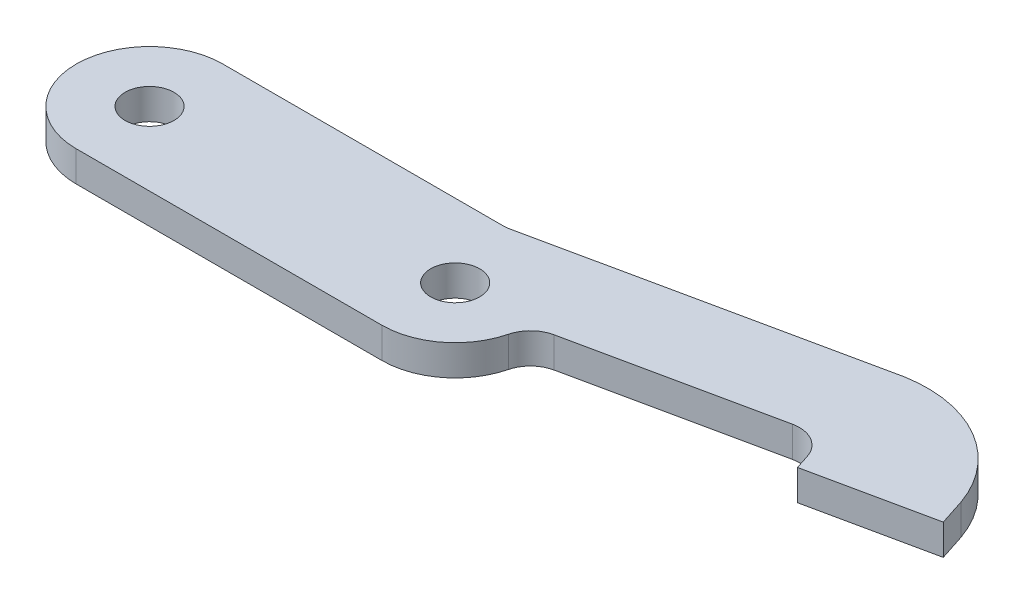
ISO-10303-21;
HEADER;
FILE_DESCRIPTION(('STEP AP214'),'2;1');
FILE_NAME('part.step','',(''),(''),'','','');
FILE_SCHEMA(('AUTOMOTIVE_DESIGN { 1 0 10303 214 1 1 1 1 }'));
ENDSEC;
DATA;
#1=APPLICATION_CONTEXT('core data for automotive mechanical design processes');
#2=APPLICATION_PROTOCOL_DEFINITION('international standard','automotive_design',2000,#1);
#3=PRODUCT_CONTEXT('',#1,'mechanical');
#4=PRODUCT('Part','Part','',(#3));
#5=PRODUCT_RELATED_PRODUCT_CATEGORY('part','',(#4));
#6=PRODUCT_DEFINITION_FORMATION('','',#4);
#7=PRODUCT_DEFINITION_CONTEXT('part definition',#1,'design');
#8=PRODUCT_DEFINITION('design','',#6,#7);
#9=PRODUCT_DEFINITION_SHAPE('','',#8);
#10=(LENGTH_UNIT() NAMED_UNIT(*) SI_UNIT(.MILLI.,.METRE.));
#11=(NAMED_UNIT(*) PLANE_ANGLE_UNIT() SI_UNIT($,.RADIAN.));
#12=(NAMED_UNIT(*) SI_UNIT($,.STERADIAN.) SOLID_ANGLE_UNIT());
#13=UNCERTAINTY_MEASURE_WITH_UNIT(LENGTH_MEASURE(1.E-05),#10,'distance_accuracy_value','');
#14=(GEOMETRIC_REPRESENTATION_CONTEXT(3) GLOBAL_UNCERTAINTY_ASSIGNED_CONTEXT((#13)) GLOBAL_UNIT_ASSIGNED_CONTEXT((#10,
#11,#12)) REPRESENTATION_CONTEXT('',''));
#15=CARTESIAN_POINT('',(0.,0.,0.));
#16=DIRECTION('',(0.,0.,1.));
#17=DIRECTION('',(1.,0.,0.));
#18=AXIS2_PLACEMENT_3D('',#15,#16,#17);
#19=CARTESIAN_POINT('',(103.549877420006,5.,-3.73359056805985));
#20=DIRECTION('',(0.,1.,0.));
#21=DIRECTION('',(0.,0.,1.));
#22=AXIS2_PLACEMENT_3D('',#19,#20,#21);
#23=PLANE('',#22);
#24=CARTESIAN_POINT('',(0.,5.,0.));
#25=DIRECTION('',(0.,1.,0.));
#26=DIRECTION('',(0.,0.,1.));
#27=AXIS2_PLACEMENT_3D('',#24,#25,#26);
#28=CIRCLE('',#27,4.);
#29=CARTESIAN_POINT('',(0.,5.,4.));
#30=VERTEX_POINT('',#29);
#31=EDGE_CURVE('E242',#30,#30,#28,.T.);
#32=ORIENTED_EDGE('',*,*,#31,.F.);
#33=EDGE_LOOP('',(#32));
#34=FACE_BOUND('',#33,.T.);
#35=CARTESIAN_POINT('',(103.549877420006,5.,-3.73359056805985));
#36=DIRECTION('',(0.,1.,0.));
#37=DIRECTION('',(0.,0.,1.));
#38=AXIS2_PLACEMENT_3D('',#35,#36,#37);
#39=CIRCLE('',#38,20.);
#40=CARTESIAN_POINT('',(122.439553034053,5.,-10.3047514393287));
#41=VERTEX_POINT('',#40);
#42=CARTESIAN_POINT('',(100.107664182939,5.,-23.4351429949768));
#43=VERTEX_POINT('',#42);
#44=EDGE_CURVE('E132',#41,#43,#39,.T.);
#45=ORIENTED_EDGE('',*,*,#44,.T.);
#46=DIRECTION('',(-0.978147600733806,0.,0.20791169081776));
#47=VECTOR('',#46,1.);
#48=CARTESIAN_POINT('',(46.3095461425795,5.,-12.));
#49=LINE('',#48,#47);
#50=CARTESIAN_POINT('',(46.8235834203399,5.,-12.109261996331));
#51=VERTEX_POINT('',#50);
#52=EDGE_CURVE('E123',#43,#51,#49,.T.);
#53=ORIENTED_EDGE('',*,*,#52,.T.);
#54=CARTESIAN_POINT('',(45.7840249662511,5.,-17.));
#55=DIRECTION('',(0.,1.,0.));
#56=DIRECTION('',(0.,0.,1.));
#57=AXIS2_PLACEMENT_3D('',#54,#55,#56);
#58=CIRCLE('',#57,5.);
#59=CARTESIAN_POINT('',(45.7840249662511,5.,-12.));
#60=VERTEX_POINT('',#59);
#61=EDGE_CURVE('E11',#51,#60,#58,.F.);
#62=ORIENTED_EDGE('',*,*,#61,.T.);
#63=DIRECTION('',(-1.,0.,0.));
#64=VECTOR('',#63,1.);
#65=CARTESIAN_POINT('',(0.,5.,-12.));
#66=LINE('',#65,#64);
#67=CARTESIAN_POINT('',(0.,5.,-12.));
#68=VERTEX_POINT('',#67);
#69=EDGE_CURVE('E131',#60,#68,#66,.T.);
#70=ORIENTED_EDGE('',*,*,#69,.T.);
#71=CARTESIAN_POINT('',(0.,5.,0.));
#72=DIRECTION('',(0.,1.,0.));
#73=DIRECTION('',(0.,0.,1.));
#74=AXIS2_PLACEMENT_3D('',#71,#72,#73);
#75=CIRCLE('',#74,12.);
#76=CARTESIAN_POINT('',(0.,5.,12.));
#77=VERTEX_POINT('',#76);
#78=EDGE_CURVE('E250',#68,#77,#75,.T.);
#79=ORIENTED_EDGE('',*,*,#78,.T.);
#80=DIRECTION('',(1.,0.,0.));
#81=VECTOR('',#80,1.);
#82=CARTESIAN_POINT('',(0.,5.,12.));
#83=LINE('',#82,#81);
#84=CARTESIAN_POINT('',(50.,5.,12.));
#85=VERTEX_POINT('',#84);
#86=EDGE_CURVE('E229',#77,#85,#83,.T.);
#87=ORIENTED_EDGE('',*,*,#86,.T.);
#88=CARTESIAN_POINT('',(50.,5.,0.));
#89=DIRECTION('',(0.,1.,0.));
#90=DIRECTION('',(0.,0.,1.));
#91=AXIS2_PLACEMENT_3D('',#88,#89,#90);
#92=CIRCLE('',#91,12.);
#93=CARTESIAN_POINT('',(61.6353980817676,5.,2.93555982374721));
#94=VERTEX_POINT('',#93);
#95=EDGE_CURVE('E246',#85,#94,#92,.T.);
#96=ORIENTED_EDGE('',*,*,#95,.T.);
#97=CARTESIAN_POINT('',(66.4834806158375,5.,4.15870975030855));
#98=DIRECTION('',(0.,1.,0.));
#99=DIRECTION('',(0.,0.,1.));
#100=AXIS2_PLACEMENT_3D('',#97,#98,#99);
#101=CIRCLE('',#100,5.);
#102=CARTESIAN_POINT('',(65.4439221617486,5.,-0.732028253360483));
#103=VERTEX_POINT('',#102);
#104=EDGE_CURVE('E169',#94,#103,#101,.F.);
#105=ORIENTED_EDGE('',*,*,#104,.T.);
#106=DIRECTION('',(0.978147600733805,0.,-0.20791169081776));
#107=VECTOR('',#106,1.);
#108=CARTESIAN_POINT('',(62.,5.,0.));
#109=LINE('',#108,#107);
#110=CARTESIAN_POINT('',(97.5926662979977,5.,-7.56545476897087));
#111=VERTEX_POINT('',#110);
#112=EDGE_CURVE('E180',#103,#111,#109,.T.);
#113=ORIENTED_EDGE('',*,*,#112,.T.);
#114=CARTESIAN_POINT('',(98.6322247520865,5.,-2.67471676530185));
#115=DIRECTION('',(0.,1.,0.));
#116=DIRECTION('',(0.,0.,1.));
#117=AXIS2_PLACEMENT_3D('',#114,#115,#116);
#118=CIRCLE('',#117,5.);
#119=CARTESIAN_POINT('',(103.388793992081,5.,-4.2158361847941));
#120=VERTEX_POINT('',#119);
#121=EDGE_CURVE('E173',#111,#120,#118,.F.);
#122=ORIENTED_EDGE('',*,*,#121,.T.);
#123=DIRECTION('',(0.308223883898451,0.,0.951313847998942));
#124=VECTOR('',#123,1.);
#125=CARTESIAN_POINT('',(104.157567187289,5.,-1.84306553080831));
#126=LINE('',#125,#124);
#127=CARTESIAN_POINT('',(104.157567187289,5.,-1.84306553080831));
#128=VERTEX_POINT('',#127);
#129=EDGE_CURVE('E177',#120,#128,#126,.T.);
#130=ORIENTED_EDGE('',*,*,#129,.T.);
#131=DIRECTION('',(0.978147600733807,0.,-0.207911690817753));
#132=VECTOR('',#131,1.);
#133=CARTESIAN_POINT('',(104.157567187289,5.,-1.84306553080831));
#134=LINE('',#133,#132);
#135=CARTESIAN_POINT('',(123.826560511596,5.,-6.02383912333345));
#136=VERTEX_POINT('',#135);
#137=EDGE_CURVE('E190',#128,#136,#134,.T.);
#138=ORIENTED_EDGE('',*,*,#137,.T.);
#139=DIRECTION('',(-0.308223883898451,0.,-0.951313847998942));
#140=VECTOR('',#139,1.);
#141=CARTESIAN_POINT('',(122.439553034053,5.,-10.3047514393287));
#142=LINE('',#141,#140);
#143=EDGE_CURVE('E137',#136,#41,#142,.T.);
#144=ORIENTED_EDGE('',*,*,#143,.T.);
#145=EDGE_LOOP('',(#45,#53,#62,#70,#79,#87,#96,#105,#113,#122,#130,#138,#144));
#146=FACE_BOUND('',#145,.T.);
#147=CARTESIAN_POINT('',(50.,5.,0.));
#148=DIRECTION('',(0.,1.,0.));
#149=DIRECTION('',(0.,0.,1.));
#150=AXIS2_PLACEMENT_3D('',#147,#148,#149);
#151=CIRCLE('',#150,4.00000000000001);
#152=CARTESIAN_POINT('',(50.,5.,4.00000000000001));
#153=VERTEX_POINT('',#152);
#154=EDGE_CURVE('E256',#153,#153,#151,.T.);
#155=ORIENTED_EDGE('',*,*,#154,.F.);
#156=EDGE_LOOP('',(#155));
#157=FACE_BOUND('',#156,.T.);
#158=ADVANCED_FACE('F32',(#34,#146,#157),#23,.T.);
#159=CARTESIAN_POINT('',(103.549877420006,0.,-3.73359056805985));
#160=DIRECTION('',(0.,1.,0.));
#161=DIRECTION('',(0.,0.,1.));
#162=AXIS2_PLACEMENT_3D('',#159,#160,#161);
#163=PLANE('',#162);
#164=CARTESIAN_POINT('',(0.,0.,0.));
#165=DIRECTION('',(0.,1.,0.));
#166=DIRECTION('',(0.,0.,1.));
#167=AXIS2_PLACEMENT_3D('',#164,#165,#166);
#168=CIRCLE('',#167,4.);
#169=CARTESIAN_POINT('',(0.,0.,4.));
#170=VERTEX_POINT('',#169);
#171=EDGE_CURVE('E253',#170,#170,#168,.T.);
#172=ORIENTED_EDGE('',*,*,#171,.T.);
#173=EDGE_LOOP('',(#172));
#174=FACE_BOUND('',#173,.T.);
#175=CARTESIAN_POINT('',(103.549877420006,0.,-3.73359056805985));
#176=DIRECTION('',(0.,1.,0.));
#177=DIRECTION('',(0.,0.,1.));
#178=AXIS2_PLACEMENT_3D('',#175,#176,#177);
#179=CIRCLE('',#178,20.);
#180=CARTESIAN_POINT('',(122.439553034053,0.,-10.3047514393287));
#181=VERTEX_POINT('',#180);
#182=CARTESIAN_POINT('',(100.107664182939,0.,-23.4351429949768));
#183=VERTEX_POINT('',#182);
#184=EDGE_CURVE('E145',#181,#183,#179,.T.);
#185=ORIENTED_EDGE('',*,*,#184,.F.);
#186=DIRECTION('',(-0.308223883898451,0.,-0.951313847998942));
#187=VECTOR('',#186,1.);
#188=CARTESIAN_POINT('',(122.439553034053,0.,-10.3047514393287));
#189=LINE('',#188,#187);
#190=CARTESIAN_POINT('',(123.826560511596,0.,-6.02383912333345));
#191=VERTEX_POINT('',#190);
#192=EDGE_CURVE('E141',#191,#181,#189,.T.);
#193=ORIENTED_EDGE('',*,*,#192,.F.);
#194=DIRECTION('',(0.978147600733807,0.,-0.207911690817753));
#195=VECTOR('',#194,1.);
#196=CARTESIAN_POINT('',(104.157567187289,0.,-1.84306553080831));
#197=LINE('',#196,#195);
#198=CARTESIAN_POINT('',(104.157567187289,0.,-1.84306553080831));
#199=VERTEX_POINT('',#198);
#200=EDGE_CURVE('E205',#199,#191,#197,.T.);
#201=ORIENTED_EDGE('',*,*,#200,.F.);
#202=DIRECTION('',(0.308223883898451,0.,0.951313847998942));
#203=VECTOR('',#202,1.);
#204=CARTESIAN_POINT('',(104.157567187289,0.,-1.84306553080831));
#205=LINE('',#204,#203);
#206=CARTESIAN_POINT('',(103.388793992081,0.,-4.2158361847941));
#207=VERTEX_POINT('',#206);
#208=EDGE_CURVE('E199',#207,#199,#205,.T.);
#209=ORIENTED_EDGE('',*,*,#208,.F.);
#210=CARTESIAN_POINT('',(98.6322247520865,0.,-2.67471676530185));
#211=DIRECTION('',(0.,1.,0.));
#212=DIRECTION('',(0.,0.,1.));
#213=AXIS2_PLACEMENT_3D('',#210,#211,#212);
#214=CIRCLE('',#213,5.);
#215=CARTESIAN_POINT('',(97.5926662979977,0.,-7.56545476897087));
#216=VERTEX_POINT('',#215);
#217=EDGE_CURVE('E171',#207,#216,#214,.T.);
#218=ORIENTED_EDGE('',*,*,#217,.T.);
#219=DIRECTION('',(0.978147600733805,0.,-0.20791169081776));
#220=VECTOR('',#219,1.);
#221=CARTESIAN_POINT('',(62.,0.,0.));
#222=LINE('',#221,#220);
#223=CARTESIAN_POINT('',(65.4439221617486,0.,-0.732028253360483));
#224=VERTEX_POINT('',#223);
#225=EDGE_CURVE('E197',#224,#216,#222,.T.);
#226=ORIENTED_EDGE('',*,*,#225,.F.);
#227=CARTESIAN_POINT('',(66.4834806158375,0.,4.15870975030855));
#228=DIRECTION('',(0.,1.,0.));
#229=DIRECTION('',(0.,0.,1.));
#230=AXIS2_PLACEMENT_3D('',#227,#228,#229);
#231=CIRCLE('',#230,5.);
#232=CARTESIAN_POINT('',(61.6353980817676,0.,2.93555982374721));
#233=VERTEX_POINT('',#232);
#234=EDGE_CURVE('E167',#224,#233,#231,.T.);
#235=ORIENTED_EDGE('',*,*,#234,.T.);
#236=CARTESIAN_POINT('',(50.,0.,0.));
#237=DIRECTION('',(0.,1.,0.));
#238=DIRECTION('',(0.,0.,1.));
#239=AXIS2_PLACEMENT_3D('',#236,#237,#238);
#240=CIRCLE('',#239,12.);
#241=CARTESIAN_POINT('',(50.,0.,12.));
#242=VERTEX_POINT('',#241);
#243=EDGE_CURVE('E203',#242,#233,#240,.T.);
#244=ORIENTED_EDGE('',*,*,#243,.F.);
#245=DIRECTION('',(1.,0.,0.));
#246=VECTOR('',#245,1.);
#247=CARTESIAN_POINT('',(0.,0.,12.));
#248=LINE('',#247,#246);
#249=CARTESIAN_POINT('',(0.,0.,12.));
#250=VERTEX_POINT('',#249);
#251=EDGE_CURVE('E208',#250,#242,#248,.T.);
#252=ORIENTED_EDGE('',*,*,#251,.F.);
#253=CARTESIAN_POINT('',(0.,0.,0.));
#254=DIRECTION('',(0.,1.,0.));
#255=DIRECTION('',(0.,0.,1.));
#256=AXIS2_PLACEMENT_3D('',#253,#254,#255);
#257=CIRCLE('',#256,12.);
#258=CARTESIAN_POINT('',(0.,0.,-12.));
#259=VERTEX_POINT('',#258);
#260=EDGE_CURVE('E234',#259,#250,#257,.T.);
#261=ORIENTED_EDGE('',*,*,#260,.F.);
#262=DIRECTION('',(-1.,0.,0.));
#263=VECTOR('',#262,1.);
#264=CARTESIAN_POINT('',(0.,0.,-12.));
#265=LINE('',#264,#263);
#266=CARTESIAN_POINT('',(45.7840249662511,0.,-12.));
#267=VERTEX_POINT('',#266);
#268=EDGE_CURVE('E235',#267,#259,#265,.T.);
#269=ORIENTED_EDGE('',*,*,#268,.F.);
#270=CARTESIAN_POINT('',(45.7840249662511,0.,-17.));
#271=DIRECTION('',(0.,1.,0.));
#272=DIRECTION('',(0.,0.,1.));
#273=AXIS2_PLACEMENT_3D('',#270,#271,#272);
#274=CIRCLE('',#273,5.);
#275=CARTESIAN_POINT('',(46.8235834203399,0.,-12.109261996331));
#276=VERTEX_POINT('',#275);
#277=EDGE_CURVE('E40',#267,#276,#274,.T.);
#278=ORIENTED_EDGE('',*,*,#277,.T.);
#279=DIRECTION('',(-0.978147600733806,0.,0.20791169081776));
#280=VECTOR('',#279,1.);
#281=CARTESIAN_POINT('',(46.3095461425795,0.,-12.));
#282=LINE('',#281,#280);
#283=EDGE_CURVE('E239',#183,#276,#282,.T.);
#284=ORIENTED_EDGE('',*,*,#283,.F.);
#285=EDGE_LOOP('',(#185,#193,#201,#209,#218,#226,#235,#244,#252,#261,#269,#278,#284));
#286=FACE_BOUND('',#285,.T.);
#287=CARTESIAN_POINT('',(50.,0.,0.));
#288=DIRECTION('',(0.,1.,0.));
#289=DIRECTION('',(0.,0.,1.));
#290=AXIS2_PLACEMENT_3D('',#287,#288,#289);
#291=CIRCLE('',#290,4.00000000000001);
#292=CARTESIAN_POINT('',(50.,0.,4.00000000000001));
#293=VERTEX_POINT('',#292);
#294=EDGE_CURVE('E259',#293,#293,#291,.T.);
#295=ORIENTED_EDGE('',*,*,#294,.T.);
#296=EDGE_LOOP('',(#295));
#297=FACE_BOUND('',#296,.T.);
#298=ADVANCED_FACE('F195',(#174,#286,#297),#163,.F.);
#299=CARTESIAN_POINT('',(103.549877420006,5.,-3.73359056805985));
#300=DIRECTION('',(0.,-1.,0.));
#301=DIRECTION('',(0.,0.,-1.));
#302=AXIS2_PLACEMENT_3D('',#299,#300,#301);
#303=CYLINDRICAL_SURFACE('',#302,20.);
#304=ORIENTED_EDGE('',*,*,#184,.T.);
#305=DIRECTION('',(0.,-1.,0.));
#306=VECTOR('',#305,1.);
#307=CARTESIAN_POINT('',(100.107664182939,5.,-23.4351429949768));
#308=LINE('',#307,#306);
#309=EDGE_CURVE('E127',#43,#183,#308,.T.);
#310=ORIENTED_EDGE('',*,*,#309,.F.);
#311=ORIENTED_EDGE('',*,*,#44,.F.);
#312=DIRECTION('',(0.,-1.,0.));
#313=VECTOR('',#312,1.);
#314=CARTESIAN_POINT('',(122.439553034053,5.,-10.3047514393287));
#315=LINE('',#314,#313);
#316=EDGE_CURVE('E214',#41,#181,#315,.T.);
#317=ORIENTED_EDGE('',*,*,#316,.T.);
#318=EDGE_LOOP('',(#304,#310,#311,#317));
#319=FACE_BOUND('',#318,.T.);
#320=ADVANCED_FACE('F143',(#319),#303,.T.);
#321=CARTESIAN_POINT('',(46.3095461425795,5.,-12.));
#322=DIRECTION('',(0.20791169081776,0.,0.978147600733805));
#323=DIRECTION('',(0.978147600733805,0.,-0.20791169081776));
#324=AXIS2_PLACEMENT_3D('',#321,#322,#323);
#325=PLANE('',#324);
#326=ORIENTED_EDGE('',*,*,#283,.T.);
#327=DIRECTION('',(0.,-1.,0.));
#328=VECTOR('',#327,1.);
#329=CARTESIAN_POINT('',(46.8235834203399,5.,-12.109261996331));
#330=LINE('',#329,#328);
#331=EDGE_CURVE('E47',#276,#51,#330,.F.);
#332=ORIENTED_EDGE('',*,*,#331,.T.);
#333=ORIENTED_EDGE('',*,*,#52,.F.);
#334=ORIENTED_EDGE('',*,*,#309,.T.);
#335=EDGE_LOOP('',(#326,#332,#333,#334));
#336=FACE_BOUND('',#335,.T.);
#337=ADVANCED_FACE('F125',(#336),#325,.F.);
#338=CARTESIAN_POINT('',(0.,5.,-12.));
#339=DIRECTION('',(0.,0.,1.));
#340=DIRECTION('',(1.,0.,0.));
#341=AXIS2_PLACEMENT_3D('',#338,#339,#340);
#342=PLANE('',#341);
#343=ORIENTED_EDGE('',*,*,#69,.F.);
#344=DIRECTION('',(0.,-1.,0.));
#345=VECTOR('',#344,1.);
#346=CARTESIAN_POINT('',(45.7840249662511,0.,-12.));
#347=LINE('',#346,#345);
#348=EDGE_CURVE('E163',#60,#267,#347,.T.);
#349=ORIENTED_EDGE('',*,*,#348,.T.);
#350=ORIENTED_EDGE('',*,*,#268,.T.);
#351=DIRECTION('',(0.,-1.,0.));
#352=VECTOR('',#351,1.);
#353=CARTESIAN_POINT('',(0.,5.,-12.));
#354=LINE('',#353,#352);
#355=EDGE_CURVE('E147',#68,#259,#354,.T.);
#356=ORIENTED_EDGE('',*,*,#355,.F.);
#357=EDGE_LOOP('',(#343,#349,#350,#356));
#358=FACE_BOUND('',#357,.T.);
#359=ADVANCED_FACE('F301',(#358),#342,.F.);
#360=CARTESIAN_POINT('',(0.,5.,0.));
#361=DIRECTION('',(0.,-1.,0.));
#362=DIRECTION('',(0.,0.,-1.));
#363=AXIS2_PLACEMENT_3D('',#360,#361,#362);
#364=CYLINDRICAL_SURFACE('',#363,12.);
#365=ORIENTED_EDGE('',*,*,#260,.T.);
#366=DIRECTION('',(0.,-1.,0.));
#367=VECTOR('',#366,1.);
#368=CARTESIAN_POINT('',(0.,5.,12.));
#369=LINE('',#368,#367);
#370=EDGE_CURVE('E152',#77,#250,#369,.T.);
#371=ORIENTED_EDGE('',*,*,#370,.F.);
#372=ORIENTED_EDGE('',*,*,#78,.F.);
#373=ORIENTED_EDGE('',*,*,#355,.T.);
#374=EDGE_LOOP('',(#365,#371,#372,#373));
#375=FACE_BOUND('',#374,.T.);
#376=ADVANCED_FACE('F298',(#375),#364,.T.);
#377=CARTESIAN_POINT('',(0.,5.,12.));
#378=DIRECTION('',(0.,0.,-1.));
#379=DIRECTION('',(-1.,0.,0.));
#380=AXIS2_PLACEMENT_3D('',#377,#378,#379);
#381=PLANE('',#380);
#382=ORIENTED_EDGE('',*,*,#251,.T.);
#383=DIRECTION('',(0.,-1.,0.));
#384=VECTOR('',#383,1.);
#385=CARTESIAN_POINT('',(50.,5.,12.));
#386=LINE('',#385,#384);
#387=EDGE_CURVE('E220',#85,#242,#386,.T.);
#388=ORIENTED_EDGE('',*,*,#387,.F.);
#389=ORIENTED_EDGE('',*,*,#86,.F.);
#390=ORIENTED_EDGE('',*,*,#370,.T.);
#391=EDGE_LOOP('',(#382,#388,#389,#390));
#392=FACE_BOUND('',#391,.T.);
#393=ADVANCED_FACE('F227',(#392),#381,.F.);
#394=CARTESIAN_POINT('',(50.,5.,0.));
#395=DIRECTION('',(0.,-1.,0.));
#396=DIRECTION('',(0.,0.,-1.));
#397=AXIS2_PLACEMENT_3D('',#394,#395,#396);
#398=CYLINDRICAL_SURFACE('',#397,12.);
#399=ORIENTED_EDGE('',*,*,#243,.T.);
#400=DIRECTION('',(0.,-1.,0.));
#401=VECTOR('',#400,1.);
#402=CARTESIAN_POINT('',(61.6353980817676,5.,2.93555982374721));
#403=LINE('',#402,#401);
#404=EDGE_CURVE('E158',#233,#94,#403,.F.);
#405=ORIENTED_EDGE('',*,*,#404,.T.);
#406=ORIENTED_EDGE('',*,*,#95,.F.);
#407=ORIENTED_EDGE('',*,*,#387,.T.);
#408=EDGE_LOOP('',(#399,#405,#406,#407));
#409=FACE_BOUND('',#408,.T.);
#410=ADVANCED_FACE('F292',(#409),#398,.T.);
#411=CARTESIAN_POINT('',(62.,5.,0.));
#412=DIRECTION('',(-0.20791169081776,0.,-0.978147600733806));
#413=DIRECTION('',(-0.978147600733806,0.,0.20791169081776));
#414=AXIS2_PLACEMENT_3D('',#411,#412,#413);
#415=PLANE('',#414);
#416=ORIENTED_EDGE('',*,*,#112,.F.);
#417=DIRECTION('',(0.,1.,0.));
#418=VECTOR('',#417,1.);
#419=CARTESIAN_POINT('',(65.4439221617486,0.,-0.732028253360483));
#420=LINE('',#419,#418);
#421=EDGE_CURVE('E149',#103,#224,#420,.F.);
#422=ORIENTED_EDGE('',*,*,#421,.T.);
#423=ORIENTED_EDGE('',*,*,#225,.T.);
#424=DIRECTION('',(0.,-1.,0.));
#425=VECTOR('',#424,1.);
#426=CARTESIAN_POINT('',(97.5926662979977,5.,-7.56545476897088));
#427=LINE('',#426,#425);
#428=EDGE_CURVE('E146',#216,#111,#427,.F.);
#429=ORIENTED_EDGE('',*,*,#428,.T.);
#430=EDGE_LOOP('',(#416,#422,#423,#429));
#431=FACE_BOUND('',#430,.T.);
#432=ADVANCED_FACE('F201',(#431),#415,.F.);
#433=CARTESIAN_POINT('',(104.157567187289,5.,-1.84306553080831));
#434=DIRECTION('',(0.951313847998942,0.,-0.308223883898451));
#435=DIRECTION('',(-0.308223883898451,0.,-0.951313847998942));
#436=AXIS2_PLACEMENT_3D('',#433,#434,#435);
#437=PLANE('',#436);
#438=ORIENTED_EDGE('',*,*,#129,.F.);
#439=DIRECTION('',(0.,-1.,0.));
#440=VECTOR('',#439,1.);
#441=CARTESIAN_POINT('',(103.388793992081,0.,-4.2158361847941));
#442=LINE('',#441,#440);
#443=EDGE_CURVE('E160',#120,#207,#442,.T.);
#444=ORIENTED_EDGE('',*,*,#443,.T.);
#445=ORIENTED_EDGE('',*,*,#208,.T.);
#446=DIRECTION('',(0.,-1.,0.));
#447=VECTOR('',#446,1.);
#448=CARTESIAN_POINT('',(104.157567187289,5.,-1.84306553080831));
#449=LINE('',#448,#447);
#450=EDGE_CURVE('E188',#128,#199,#449,.T.);
#451=ORIENTED_EDGE('',*,*,#450,.F.);
#452=EDGE_LOOP('',(#438,#444,#445,#451));
#453=FACE_BOUND('',#452,.T.);
#454=ADVANCED_FACE('F185',(#453),#437,.F.);
#455=CARTESIAN_POINT('',(104.157567187289,5.,-1.84306553080831));
#456=DIRECTION('',(-0.207911690817753,0.,-0.978147600733807));
#457=DIRECTION('',(-0.978147600733807,0.,0.207911690817753));
#458=AXIS2_PLACEMENT_3D('',#455,#456,#457);
#459=PLANE('',#458);
#460=ORIENTED_EDGE('',*,*,#200,.T.);
#461=DIRECTION('',(0.,-1.,0.));
#462=VECTOR('',#461,1.);
#463=CARTESIAN_POINT('',(123.826560511596,5.,-6.02383912333345));
#464=LINE('',#463,#462);
#465=EDGE_CURVE('E216',#136,#191,#464,.T.);
#466=ORIENTED_EDGE('',*,*,#465,.F.);
#467=ORIENTED_EDGE('',*,*,#137,.F.);
#468=ORIENTED_EDGE('',*,*,#450,.T.);
#469=EDGE_LOOP('',(#460,#466,#467,#468));
#470=FACE_BOUND('',#469,.T.);
#471=ADVANCED_FACE('F283',(#470),#459,.F.);
#472=CARTESIAN_POINT('',(122.439553034053,5.,-10.3047514393287));
#473=DIRECTION('',(-0.951313847998942,0.,0.308223883898451));
#474=DIRECTION('',(0.308223883898451,0.,0.951313847998942));
#475=AXIS2_PLACEMENT_3D('',#472,#473,#474);
#476=PLANE('',#475);
#477=ORIENTED_EDGE('',*,*,#192,.T.);
#478=ORIENTED_EDGE('',*,*,#316,.F.);
#479=ORIENTED_EDGE('',*,*,#143,.F.);
#480=ORIENTED_EDGE('',*,*,#465,.T.);
#481=EDGE_LOOP('',(#477,#478,#479,#480));
#482=FACE_BOUND('',#481,.T.);
#483=ADVANCED_FACE('F280',(#482),#476,.F.);
#484=CARTESIAN_POINT('',(0.,5.,0.));
#485=DIRECTION('',(0.,-1.,0.));
#486=DIRECTION('',(0.,0.,-1.));
#487=AXIS2_PLACEMENT_3D('',#484,#485,#486);
#488=CYLINDRICAL_SURFACE('',#487,4.);
#489=ORIENTED_EDGE('',*,*,#31,.T.);
#490=EDGE_LOOP('',(#489));
#491=FACE_BOUND('',#490,.T.);
#492=ORIENTED_EDGE('',*,*,#171,.F.);
#493=EDGE_LOOP('',(#492));
#494=FACE_BOUND('',#493,.T.);
#495=ADVANCED_FACE('F277',(#491,#494),#488,.F.);
#496=CARTESIAN_POINT('',(50.,5.,0.));
#497=DIRECTION('',(0.,-1.,0.));
#498=DIRECTION('',(0.,0.,-1.));
#499=AXIS2_PLACEMENT_3D('',#496,#497,#498);
#500=CYLINDRICAL_SURFACE('',#499,4.00000000000001);
#501=ORIENTED_EDGE('',*,*,#154,.T.);
#502=EDGE_LOOP('',(#501));
#503=FACE_BOUND('',#502,.T.);
#504=ORIENTED_EDGE('',*,*,#294,.F.);
#505=EDGE_LOOP('',(#504));
#506=FACE_BOUND('',#505,.T.);
#507=ADVANCED_FACE('F265',(#503,#506),#500,.F.);
#508=CARTESIAN_POINT('',(66.4834806158375,5.,4.15870975030855));
#509=DIRECTION('',(0.,-1.,0.));
#510=DIRECTION('',(0.,0.,-1.));
#511=AXIS2_PLACEMENT_3D('',#508,#509,#510);
#512=CYLINDRICAL_SURFACE('',#511,5.);
#513=ORIENTED_EDGE('',*,*,#104,.F.);
#514=ORIENTED_EDGE('',*,*,#404,.F.);
#515=ORIENTED_EDGE('',*,*,#234,.F.);
#516=ORIENTED_EDGE('',*,*,#421,.F.);
#517=EDGE_LOOP('',(#513,#514,#515,#516));
#518=FACE_BOUND('',#517,.T.);
#519=ADVANCED_FACE('F309',(#518),#512,.F.);
#520=CARTESIAN_POINT('',(98.6322247520865,5.,-2.67471676530185));
#521=DIRECTION('',(0.,1.,0.));
#522=DIRECTION('',(0.,0.,1.));
#523=AXIS2_PLACEMENT_3D('',#520,#521,#522);
#524=CYLINDRICAL_SURFACE('',#523,5.);
#525=ORIENTED_EDGE('',*,*,#121,.F.);
#526=ORIENTED_EDGE('',*,*,#428,.F.);
#527=ORIENTED_EDGE('',*,*,#217,.F.);
#528=ORIENTED_EDGE('',*,*,#443,.F.);
#529=EDGE_LOOP('',(#525,#526,#527,#528));
#530=FACE_BOUND('',#529,.T.);
#531=ADVANCED_FACE('F192',(#530),#524,.F.);
#532=CARTESIAN_POINT('',(45.7840249662511,5.,-17.));
#533=DIRECTION('',(0.,1.,0.));
#534=DIRECTION('',(0.,0.,1.));
#535=AXIS2_PLACEMENT_3D('',#532,#533,#534);
#536=CYLINDRICAL_SURFACE('',#535,5.);
#537=ORIENTED_EDGE('',*,*,#61,.F.);
#538=ORIENTED_EDGE('',*,*,#331,.F.);
#539=ORIENTED_EDGE('',*,*,#277,.F.);
#540=ORIENTED_EDGE('',*,*,#348,.F.);
#541=EDGE_LOOP('',(#537,#538,#539,#540));
#542=FACE_BOUND('',#541,.T.);
#543=ADVANCED_FACE('F34',(#542),#536,.F.);
#544=CLOSED_SHELL('',(#158,#298,#320,#337,#359,#376,#393,#410,#432,#454,#471,#483,#495,#507,
#519,#531,#543));
#545=MANIFOLD_SOLID_BREP('B2',#544);
#546=ADVANCED_BREP_SHAPE_REPRESENTATION('',(#18,#545),#14);
#547=SHAPE_DEFINITION_REPRESENTATION(#9,#546);
ENDSEC;
END-ISO-10303-21;
